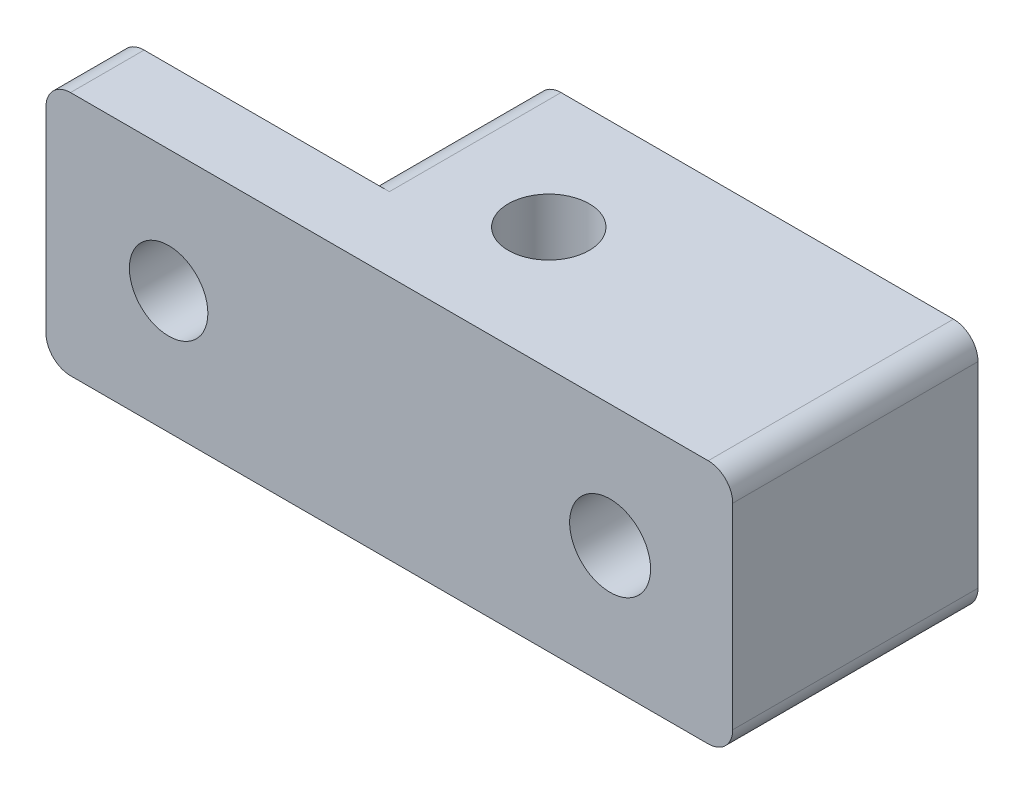
ISO-10303-21;
HEADER;
FILE_DESCRIPTION(('STEP AP214'),'2;1');
FILE_NAME('part.step','',(''),(''),'','','');
FILE_SCHEMA(('AUTOMOTIVE_DESIGN { 1 0 10303 214 1 1 1 1 }'));
ENDSEC;
DATA;
#1=APPLICATION_CONTEXT('core data for automotive mechanical design processes');
#2=APPLICATION_PROTOCOL_DEFINITION('international standard','automotive_design',2000,#1);
#3=PRODUCT_CONTEXT('',#1,'mechanical');
#4=PRODUCT('Part','Part','',(#3));
#5=PRODUCT_RELATED_PRODUCT_CATEGORY('part','',(#4));
#6=PRODUCT_DEFINITION_FORMATION('','',#4);
#7=PRODUCT_DEFINITION_CONTEXT('part definition',#1,'design');
#8=PRODUCT_DEFINITION('design','',#6,#7);
#9=PRODUCT_DEFINITION_SHAPE('','',#8);
#10=(LENGTH_UNIT() NAMED_UNIT(*) SI_UNIT(.MILLI.,.METRE.));
#11=(NAMED_UNIT(*) PLANE_ANGLE_UNIT() SI_UNIT($,.RADIAN.));
#12=(NAMED_UNIT(*) SI_UNIT($,.STERADIAN.) SOLID_ANGLE_UNIT());
#13=UNCERTAINTY_MEASURE_WITH_UNIT(LENGTH_MEASURE(1.E-05),#10,'distance_accuracy_value','');
#14=(GEOMETRIC_REPRESENTATION_CONTEXT(3) GLOBAL_UNCERTAINTY_ASSIGNED_CONTEXT((#13)) GLOBAL_UNIT_ASSIGNED_CONTEXT((#10,
#11,#12)) REPRESENTATION_CONTEXT('',''));
#15=CARTESIAN_POINT('',(0.,0.,0.));
#16=DIRECTION('',(0.,0.,1.));
#17=DIRECTION('',(1.,0.,0.));
#18=AXIS2_PLACEMENT_3D('',#15,#16,#17);
#19=CARTESIAN_POINT('',(0.,0.,0.));
#20=DIRECTION('',(0.,0.,1.));
#21=DIRECTION('',(1.,0.,0.));
#22=AXIS2_PLACEMENT_3D('',#19,#20,#21);
#23=PLANE('',#22);
#24=CARTESIAN_POINT('',(0.,0.,0.));
#25=DIRECTION('',(0.,0.,1.));
#26=DIRECTION('',(1.,0.,0.));
#27=AXIS2_PLACEMENT_3D('',#24,#25,#26);
#28=CIRCLE('',#27,1.65);
#29=CARTESIAN_POINT('',(1.65,0.,0.));
#30=VERTEX_POINT('',#29);
#31=EDGE_CURVE('E227',#30,#30,#28,.T.);
#32=ORIENTED_EDGE('',*,*,#31,.T.);
#33=EDGE_LOOP('',(#32));
#34=FACE_BOUND('',#33,.T.);
#35=DIRECTION('',(1.,0.,0.));
#36=VECTOR('',#35,1.);
#37=CARTESIAN_POINT('',(-23.,-5.,0.));
#38=LINE('',#37,#36);
#39=CARTESIAN_POINT('',(-12.,-5.,0.));
#40=VERTEX_POINT('',#39);
#41=CARTESIAN_POINT('',(3.99999999999999,-5.,0.));
#42=VERTEX_POINT('',#41);
#43=EDGE_CURVE('E141',#40,#42,#38,.T.);
#44=ORIENTED_EDGE('',*,*,#43,.F.);
#45=CARTESIAN_POINT('',(-12.,-4.,0.));
#46=DIRECTION('',(0.,0.,1.));
#47=DIRECTION('',(1.,0.,0.));
#48=AXIS2_PLACEMENT_3D('',#45,#46,#47);
#49=CIRCLE('',#48,1.);
#50=CARTESIAN_POINT('',(-13.,-4.,0.));
#51=VERTEX_POINT('',#50);
#52=EDGE_CURVE('E125',#40,#51,#49,.F.);
#53=ORIENTED_EDGE('',*,*,#52,.T.);
#54=DIRECTION('',(0.,1.,0.));
#55=VECTOR('',#54,1.);
#56=CARTESIAN_POINT('',(-13.,0.,0.));
#57=LINE('',#56,#55);
#58=CARTESIAN_POINT('',(-13.,4.,0.));
#59=VERTEX_POINT('',#58);
#60=EDGE_CURVE('E206',#51,#59,#57,.T.);
#61=ORIENTED_EDGE('',*,*,#60,.T.);
#62=CARTESIAN_POINT('',(-12.,4.,0.));
#63=DIRECTION('',(0.,0.,1.));
#64=DIRECTION('',(1.,0.,0.));
#65=AXIS2_PLACEMENT_3D('',#62,#63,#64);
#66=CIRCLE('',#65,1.);
#67=CARTESIAN_POINT('',(-12.,5.,0.));
#68=VERTEX_POINT('',#67);
#69=EDGE_CURVE('E136',#59,#68,#66,.F.);
#70=ORIENTED_EDGE('',*,*,#69,.T.);
#71=DIRECTION('',(-1.,0.,0.));
#72=VECTOR('',#71,1.);
#73=CARTESIAN_POINT('',(-23.,5.,0.));
#74=LINE('',#73,#72);
#75=CARTESIAN_POINT('',(3.99999999999999,5.,0.));
#76=VERTEX_POINT('',#75);
#77=EDGE_CURVE('E152',#76,#68,#74,.T.);
#78=ORIENTED_EDGE('',*,*,#77,.F.);
#79=CARTESIAN_POINT('',(4.,4.,0.));
#80=DIRECTION('',(0.,0.,1.));
#81=DIRECTION('',(1.,0.,0.));
#82=AXIS2_PLACEMENT_3D('',#79,#80,#81);
#83=CIRCLE('',#82,1.);
#84=CARTESIAN_POINT('',(5.,4.,0.));
#85=VERTEX_POINT('',#84);
#86=EDGE_CURVE('E146',#76,#85,#83,.F.);
#87=ORIENTED_EDGE('',*,*,#86,.T.);
#88=DIRECTION('',(0.,1.,0.));
#89=VECTOR('',#88,1.);
#90=CARTESIAN_POINT('',(5.,5.,0.));
#91=LINE('',#90,#89);
#92=CARTESIAN_POINT('',(5.,-4.,0.));
#93=VERTEX_POINT('',#92);
#94=EDGE_CURVE('E158',#93,#85,#91,.T.);
#95=ORIENTED_EDGE('',*,*,#94,.F.);
#96=CARTESIAN_POINT('',(4.,-4.,0.));
#97=DIRECTION('',(0.,0.,1.));
#98=DIRECTION('',(1.,0.,0.));
#99=AXIS2_PLACEMENT_3D('',#96,#97,#98);
#100=CIRCLE('',#99,1.);
#101=EDGE_CURVE('E150',#93,#42,#100,.F.);
#102=ORIENTED_EDGE('',*,*,#101,.T.);
#103=EDGE_LOOP('',(#44,#53,#61,#70,#78,#87,#95,#102));
#104=FACE_BOUND('',#103,.T.);
#105=ADVANCED_FACE('F35',(#34,#104),#23,.F.);
#106=CARTESIAN_POINT('',(-23.,5.,10.));
#107=DIRECTION('',(0.,-1.,0.));
#108=DIRECTION('',(0.,0.,-1.));
#109=AXIS2_PLACEMENT_3D('',#106,#107,#108);
#110=PLANE('',#109);
#111=CARTESIAN_POINT('',(-7.5,5.,5.));
#112=DIRECTION('',(0.,1.,0.));
#113=DIRECTION('',(0.,0.,1.));
#114=AXIS2_PLACEMENT_3D('',#111,#112,#113);
#115=CIRCLE('',#114,1.65);
#116=CARTESIAN_POINT('',(-7.5,5.,6.65));
#117=VERTEX_POINT('',#116);
#118=EDGE_CURVE('E217',#117,#117,#115,.T.);
#119=ORIENTED_EDGE('',*,*,#118,.F.);
#120=EDGE_LOOP('',(#119));
#121=FACE_BOUND('',#120,.T.);
#122=ORIENTED_EDGE('',*,*,#77,.T.);
#123=DIRECTION('',(0.,0.,-1.));
#124=VECTOR('',#123,1.);
#125=CARTESIAN_POINT('',(-12.,5.,7.));
#126=LINE('',#125,#124);
#127=CARTESIAN_POINT('',(-12.,5.,7.));
#128=VERTEX_POINT('',#127);
#129=EDGE_CURVE('E177',#68,#128,#126,.F.);
#130=ORIENTED_EDGE('',*,*,#129,.T.);
#131=DIRECTION('',(1.,0.,0.));
#132=VECTOR('',#131,1.);
#133=CARTESIAN_POINT('',(0.,5.,7.));
#134=LINE('',#133,#132);
#135=CARTESIAN_POINT('',(-22.,5.,7.));
#136=VERTEX_POINT('',#135);
#137=EDGE_CURVE('E213',#136,#128,#134,.T.);
#138=ORIENTED_EDGE('',*,*,#137,.F.);
#139=DIRECTION('',(0.,0.,-1.));
#140=VECTOR('',#139,1.);
#141=CARTESIAN_POINT('',(-22.,5.,10.));
#142=LINE('',#141,#140);
#143=CARTESIAN_POINT('',(-22.,5.,10.));
#144=VERTEX_POINT('',#143);
#145=EDGE_CURVE('E172',#136,#144,#142,.F.);
#146=ORIENTED_EDGE('',*,*,#145,.T.);
#147=DIRECTION('',(-1.,0.,0.));
#148=VECTOR('',#147,1.);
#149=CARTESIAN_POINT('',(-23.,5.,10.));
#150=LINE('',#149,#148);
#151=CARTESIAN_POINT('',(3.99999999999999,5.,10.));
#152=VERTEX_POINT('',#151);
#153=EDGE_CURVE('E155',#152,#144,#150,.T.);
#154=ORIENTED_EDGE('',*,*,#153,.F.);
#155=DIRECTION('',(0.,0.,-1.));
#156=VECTOR('',#155,1.);
#157=CARTESIAN_POINT('',(4.,5.,10.));
#158=LINE('',#157,#156);
#159=EDGE_CURVE('E174',#152,#76,#158,.T.);
#160=ORIENTED_EDGE('',*,*,#159,.T.);
#161=EDGE_LOOP('',(#122,#130,#138,#146,#154,#160));
#162=FACE_BOUND('',#161,.T.);
#163=ADVANCED_FACE('F255',(#121,#162),#110,.F.);
#164=CARTESIAN_POINT('',(-23.,5.,10.));
#165=DIRECTION('',(1.,0.,0.));
#166=DIRECTION('',(0.,0.,-1.));
#167=AXIS2_PLACEMENT_3D('',#164,#165,#166);
#168=PLANE('',#167);
#169=DIRECTION('',(0.,-1.,0.));
#170=VECTOR('',#169,1.);
#171=CARTESIAN_POINT('',(-23.,5.,10.));
#172=LINE('',#171,#170);
#173=CARTESIAN_POINT('',(-23.,4.,10.));
#174=VERTEX_POINT('',#173);
#175=CARTESIAN_POINT('',(-23.,-4.,10.));
#176=VERTEX_POINT('',#175);
#177=EDGE_CURVE('E235',#174,#176,#172,.T.);
#178=ORIENTED_EDGE('',*,*,#177,.F.);
#179=DIRECTION('',(0.,0.,-1.));
#180=VECTOR('',#179,1.);
#181=CARTESIAN_POINT('',(-23.,4.,10.));
#182=LINE('',#181,#180);
#183=CARTESIAN_POINT('',(-23.,4.,7.));
#184=VERTEX_POINT('',#183);
#185=EDGE_CURVE('E195',#174,#184,#182,.T.);
#186=ORIENTED_EDGE('',*,*,#185,.T.);
#187=DIRECTION('',(0.,1.,0.));
#188=VECTOR('',#187,1.);
#189=CARTESIAN_POINT('',(-23.,0.,7.));
#190=LINE('',#189,#188);
#191=CARTESIAN_POINT('',(-23.,-4.,7.));
#192=VERTEX_POINT('',#191);
#193=EDGE_CURVE('E208',#192,#184,#190,.T.);
#194=ORIENTED_EDGE('',*,*,#193,.F.);
#195=DIRECTION('',(0.,0.,-1.));
#196=VECTOR('',#195,1.);
#197=CARTESIAN_POINT('',(-23.,-4.,10.));
#198=LINE('',#197,#196);
#199=EDGE_CURVE('E193',#192,#176,#198,.F.);
#200=ORIENTED_EDGE('',*,*,#199,.T.);
#201=EDGE_LOOP('',(#178,#186,#194,#200));
#202=FACE_BOUND('',#201,.T.);
#203=ADVANCED_FACE('F262',(#202),#168,.F.);
#204=CARTESIAN_POINT('',(-23.,-5.,10.));
#205=DIRECTION('',(0.,1.,0.));
#206=DIRECTION('',(0.,0.,1.));
#207=AXIS2_PLACEMENT_3D('',#204,#205,#206);
#208=PLANE('',#207);
#209=CARTESIAN_POINT('',(-7.5,-5.,5.));
#210=DIRECTION('',(0.,1.,0.));
#211=DIRECTION('',(0.,0.,1.));
#212=AXIS2_PLACEMENT_3D('',#209,#210,#211);
#213=CIRCLE('',#212,1.65);
#214=CARTESIAN_POINT('',(-7.5,-5.,6.65));
#215=VERTEX_POINT('',#214);
#216=EDGE_CURVE('E219',#215,#215,#213,.T.);
#217=ORIENTED_EDGE('',*,*,#216,.T.);
#218=EDGE_LOOP('',(#217));
#219=FACE_BOUND('',#218,.T.);
#220=DIRECTION('',(-1.,0.,0.));
#221=VECTOR('',#220,1.);
#222=CARTESIAN_POINT('',(0.,-5.,7.));
#223=LINE('',#222,#221);
#224=CARTESIAN_POINT('',(-12.,-5.,7.));
#225=VERTEX_POINT('',#224);
#226=CARTESIAN_POINT('',(-22.,-5.,7.));
#227=VERTEX_POINT('',#226);
#228=EDGE_CURVE('E144',#225,#227,#223,.T.);
#229=ORIENTED_EDGE('',*,*,#228,.F.);
#230=DIRECTION('',(0.,0.,-1.));
#231=VECTOR('',#230,1.);
#232=CARTESIAN_POINT('',(-12.,-5.,0.));
#233=LINE('',#232,#231);
#234=EDGE_CURVE('E129',#225,#40,#233,.T.);
#235=ORIENTED_EDGE('',*,*,#234,.T.);
#236=ORIENTED_EDGE('',*,*,#43,.T.);
#237=DIRECTION('',(0.,0.,-1.));
#238=VECTOR('',#237,1.);
#239=CARTESIAN_POINT('',(4.,-5.,10.));
#240=LINE('',#239,#238);
#241=CARTESIAN_POINT('',(3.99999999999999,-5.,10.));
#242=VERTEX_POINT('',#241);
#243=EDGE_CURVE('E147',#42,#242,#240,.F.);
#244=ORIENTED_EDGE('',*,*,#243,.T.);
#245=DIRECTION('',(1.,0.,0.));
#246=VECTOR('',#245,1.);
#247=CARTESIAN_POINT('',(-23.,-5.,10.));
#248=LINE('',#247,#246);
#249=CARTESIAN_POINT('',(-22.,-5.,10.));
#250=VERTEX_POINT('',#249);
#251=EDGE_CURVE('E164',#250,#242,#248,.T.);
#252=ORIENTED_EDGE('',*,*,#251,.F.);
#253=DIRECTION('',(0.,0.,-1.));
#254=VECTOR('',#253,1.);
#255=CARTESIAN_POINT('',(-22.,-5.,10.));
#256=LINE('',#255,#254);
#257=EDGE_CURVE('E162',#250,#227,#256,.T.);
#258=ORIENTED_EDGE('',*,*,#257,.T.);
#259=EDGE_LOOP('',(#229,#235,#236,#244,#252,#258));
#260=FACE_BOUND('',#259,.T.);
#261=ADVANCED_FACE('F140',(#219,#260),#208,.F.);
#262=CARTESIAN_POINT('',(-18.,0.,10.));
#263=DIRECTION('',(0.,0.,-1.));
#264=DIRECTION('',(-1.,0.,0.));
#265=AXIS2_PLACEMENT_3D('',#262,#263,#264);
#266=CYLINDRICAL_SURFACE('',#265,1.6);
#267=CARTESIAN_POINT('',(-18.,0.,10.));
#268=DIRECTION('',(0.,0.,1.));
#269=DIRECTION('',(1.,0.,0.));
#270=AXIS2_PLACEMENT_3D('',#267,#268,#269);
#271=CIRCLE('',#270,1.6);
#272=CARTESIAN_POINT('',(-16.4,0.,10.));
#273=VERTEX_POINT('',#272);
#274=EDGE_CURVE('E222',#273,#273,#271,.T.);
#275=ORIENTED_EDGE('',*,*,#274,.T.);
#276=EDGE_LOOP('',(#275));
#277=FACE_BOUND('',#276,.T.);
#278=CARTESIAN_POINT('',(-18.,0.,7.));
#279=DIRECTION('',(0.,0.,-1.));
#280=DIRECTION('',(-1.,0.,0.));
#281=AXIS2_PLACEMENT_3D('',#278,#279,#280);
#282=CIRCLE('',#281,1.6);
#283=CARTESIAN_POINT('',(-19.6,0.,7.));
#284=VERTEX_POINT('',#283);
#285=EDGE_CURVE('E215',#284,#284,#282,.F.);
#286=ORIENTED_EDGE('',*,*,#285,.F.);
#287=EDGE_LOOP('',(#286));
#288=FACE_BOUND('',#287,.T.);
#289=ADVANCED_FACE('F293',(#277,#288),#266,.F.);
#290=CARTESIAN_POINT('',(0.,0.,10.));
#291=DIRECTION('',(0.,0.,1.));
#292=DIRECTION('',(1.,0.,0.));
#293=AXIS2_PLACEMENT_3D('',#290,#291,#292);
#294=PLANE('',#293);
#295=CARTESIAN_POINT('',(0.,0.,10.));
#296=DIRECTION('',(0.,0.,1.));
#297=DIRECTION('',(1.,0.,0.));
#298=AXIS2_PLACEMENT_3D('',#295,#296,#297);
#299=CIRCLE('',#298,1.65);
#300=CARTESIAN_POINT('',(1.65,0.,10.));
#301=VERTEX_POINT('',#300);
#302=EDGE_CURVE('E228',#301,#301,#299,.T.);
#303=ORIENTED_EDGE('',*,*,#302,.F.);
#304=EDGE_LOOP('',(#303));
#305=FACE_BOUND('',#304,.T.);
#306=ORIENTED_EDGE('',*,*,#251,.T.);
#307=CARTESIAN_POINT('',(4.,-4.,10.));
#308=DIRECTION('',(0.,0.,1.));
#309=DIRECTION('',(1.,0.,0.));
#310=AXIS2_PLACEMENT_3D('',#307,#308,#309);
#311=CIRCLE('',#310,1.);
#312=CARTESIAN_POINT('',(5.,-4.,10.));
#313=VERTEX_POINT('',#312);
#314=EDGE_CURVE('E191',#242,#313,#311,.T.);
#315=ORIENTED_EDGE('',*,*,#314,.T.);
#316=DIRECTION('',(0.,1.,0.));
#317=VECTOR('',#316,1.);
#318=CARTESIAN_POINT('',(5.,5.,10.));
#319=LINE('',#318,#317);
#320=CARTESIAN_POINT('',(5.,4.,10.));
#321=VERTEX_POINT('',#320);
#322=EDGE_CURVE('E151',#313,#321,#319,.T.);
#323=ORIENTED_EDGE('',*,*,#322,.T.);
#324=CARTESIAN_POINT('',(4.,4.,10.));
#325=DIRECTION('',(0.,0.,1.));
#326=DIRECTION('',(1.,0.,0.));
#327=AXIS2_PLACEMENT_3D('',#324,#325,#326);
#328=CIRCLE('',#327,1.);
#329=EDGE_CURVE('E189',#321,#152,#328,.T.);
#330=ORIENTED_EDGE('',*,*,#329,.T.);
#331=ORIENTED_EDGE('',*,*,#153,.T.);
#332=CARTESIAN_POINT('',(-22.,4.,10.));
#333=DIRECTION('',(0.,0.,1.));
#334=DIRECTION('',(1.,0.,0.));
#335=AXIS2_PLACEMENT_3D('',#332,#333,#334);
#336=CIRCLE('',#335,1.);
#337=EDGE_CURVE('E187',#144,#174,#336,.T.);
#338=ORIENTED_EDGE('',*,*,#337,.T.);
#339=ORIENTED_EDGE('',*,*,#177,.T.);
#340=CARTESIAN_POINT('',(-22.,-4.,10.));
#341=DIRECTION('',(0.,0.,1.));
#342=DIRECTION('',(1.,0.,0.));
#343=AXIS2_PLACEMENT_3D('',#340,#341,#342);
#344=CIRCLE('',#343,1.);
#345=EDGE_CURVE('E185',#176,#250,#344,.T.);
#346=ORIENTED_EDGE('',*,*,#345,.T.);
#347=EDGE_LOOP('',(#306,#315,#323,#330,#331,#338,#339,#346));
#348=FACE_BOUND('',#347,.T.);
#349=ORIENTED_EDGE('',*,*,#274,.F.);
#350=EDGE_LOOP('',(#349));
#351=FACE_BOUND('',#350,.T.);
#352=ADVANCED_FACE('F251',(#305,#348,#351),#294,.T.);
#353=CARTESIAN_POINT('',(5.,5.,10.));
#354=DIRECTION('',(-1.,0.,0.));
#355=DIRECTION('',(0.,-1.,0.));
#356=AXIS2_PLACEMENT_3D('',#353,#354,#355);
#357=PLANE('',#356);
#358=ORIENTED_EDGE('',*,*,#322,.F.);
#359=DIRECTION('',(0.,0.,-1.));
#360=VECTOR('',#359,1.);
#361=CARTESIAN_POINT('',(5.,-4.,10.));
#362=LINE('',#361,#360);
#363=EDGE_CURVE('E182',#313,#93,#362,.T.);
#364=ORIENTED_EDGE('',*,*,#363,.T.);
#365=ORIENTED_EDGE('',*,*,#94,.T.);
#366=DIRECTION('',(0.,0.,-1.));
#367=VECTOR('',#366,1.);
#368=CARTESIAN_POINT('',(5.,4.,10.));
#369=LINE('',#368,#367);
#370=EDGE_CURVE('E180',#85,#321,#369,.F.);
#371=ORIENTED_EDGE('',*,*,#370,.T.);
#372=EDGE_LOOP('',(#358,#364,#365,#371));
#373=FACE_BOUND('',#372,.T.);
#374=ADVANCED_FACE('F243',(#373),#357,.F.);
#375=CARTESIAN_POINT('',(0.,0.,10.));
#376=DIRECTION('',(0.,0.,-1.));
#377=DIRECTION('',(-1.,0.,0.));
#378=AXIS2_PLACEMENT_3D('',#375,#376,#377);
#379=CYLINDRICAL_SURFACE('',#378,1.65);
#380=ORIENTED_EDGE('',*,*,#302,.T.);
#381=EDGE_LOOP('',(#380));
#382=FACE_BOUND('',#381,.T.);
#383=ORIENTED_EDGE('',*,*,#31,.F.);
#384=EDGE_LOOP('',(#383));
#385=FACE_BOUND('',#384,.T.);
#386=ADVANCED_FACE('F299',(#382,#385),#379,.F.);
#387=CARTESIAN_POINT('',(-7.5,-5.,5.));
#388=DIRECTION('',(0.,1.,0.));
#389=DIRECTION('',(0.,0.,1.));
#390=AXIS2_PLACEMENT_3D('',#387,#388,#389);
#391=CYLINDRICAL_SURFACE('',#390,1.65);
#392=ORIENTED_EDGE('',*,*,#216,.F.);
#393=EDGE_LOOP('',(#392));
#394=FACE_BOUND('',#393,.T.);
#395=ORIENTED_EDGE('',*,*,#118,.T.);
#396=EDGE_LOOP('',(#395));
#397=FACE_BOUND('',#396,.T.);
#398=ADVANCED_FACE('F309',(#394,#397),#391,.F.);
#399=CARTESIAN_POINT('',(-13.,0.,7.));
#400=DIRECTION('',(-1.,0.,0.));
#401=DIRECTION('',(0.,0.,1.));
#402=AXIS2_PLACEMENT_3D('',#399,#400,#401);
#403=PLANE('',#402);
#404=ORIENTED_EDGE('',*,*,#60,.F.);
#405=DIRECTION('',(0.,0.,-1.));
#406=VECTOR('',#405,1.);
#407=CARTESIAN_POINT('',(-13.,-4.,7.));
#408=LINE('',#407,#406);
#409=CARTESIAN_POINT('',(-13.,-4.,7.));
#410=VERTEX_POINT('',#409);
#411=EDGE_CURVE('E130',#51,#410,#408,.F.);
#412=ORIENTED_EDGE('',*,*,#411,.T.);
#413=DIRECTION('',(0.,1.,0.));
#414=VECTOR('',#413,1.);
#415=CARTESIAN_POINT('',(-13.,0.,7.));
#416=LINE('',#415,#414);
#417=CARTESIAN_POINT('',(-13.,4.,7.));
#418=VERTEX_POINT('',#417);
#419=EDGE_CURVE('E202',#410,#418,#416,.T.);
#420=ORIENTED_EDGE('',*,*,#419,.T.);
#421=DIRECTION('',(0.,0.,-1.));
#422=VECTOR('',#421,1.);
#423=CARTESIAN_POINT('',(-13.,4.,0.));
#424=LINE('',#423,#422);
#425=EDGE_CURVE('E135',#418,#59,#424,.T.);
#426=ORIENTED_EDGE('',*,*,#425,.T.);
#427=EDGE_LOOP('',(#404,#412,#420,#426));
#428=FACE_BOUND('',#427,.T.);
#429=ADVANCED_FACE('F304',(#428),#403,.T.);
#430=CARTESIAN_POINT('',(0.,0.,7.));
#431=DIRECTION('',(0.,0.,-1.));
#432=DIRECTION('',(-1.,0.,0.));
#433=AXIS2_PLACEMENT_3D('',#430,#431,#432);
#434=PLANE('',#433);
#435=ORIENTED_EDGE('',*,*,#193,.T.);
#436=CARTESIAN_POINT('',(-22.,4.,7.));
#437=DIRECTION('',(0.,0.,-1.));
#438=DIRECTION('',(-1.,0.,0.));
#439=AXIS2_PLACEMENT_3D('',#436,#437,#438);
#440=CIRCLE('',#439,1.);
#441=EDGE_CURVE('E50',#184,#136,#440,.T.);
#442=ORIENTED_EDGE('',*,*,#441,.T.);
#443=ORIENTED_EDGE('',*,*,#137,.T.);
#444=CARTESIAN_POINT('',(-12.,4.,7.));
#445=DIRECTION('',(0.,0.,-1.));
#446=DIRECTION('',(-1.,0.,0.));
#447=AXIS2_PLACEMENT_3D('',#444,#445,#446);
#448=CIRCLE('',#447,1.);
#449=EDGE_CURVE('E11',#128,#418,#448,.F.);
#450=ORIENTED_EDGE('',*,*,#449,.T.);
#451=ORIENTED_EDGE('',*,*,#419,.F.);
#452=CARTESIAN_POINT('',(-12.,-4.,7.));
#453=DIRECTION('',(0.,0.,-1.));
#454=DIRECTION('',(-1.,0.,0.));
#455=AXIS2_PLACEMENT_3D('',#452,#453,#454);
#456=CIRCLE('',#455,1.);
#457=EDGE_CURVE('E43',#410,#225,#456,.F.);
#458=ORIENTED_EDGE('',*,*,#457,.T.);
#459=ORIENTED_EDGE('',*,*,#228,.T.);
#460=CARTESIAN_POINT('',(-22.,-4.,7.));
#461=DIRECTION('',(0.,0.,-1.));
#462=DIRECTION('',(-1.,0.,0.));
#463=AXIS2_PLACEMENT_3D('',#460,#461,#462);
#464=CIRCLE('',#463,1.);
#465=EDGE_CURVE('E58',#227,#192,#464,.T.);
#466=ORIENTED_EDGE('',*,*,#465,.T.);
#467=EDGE_LOOP('',(#435,#442,#443,#450,#451,#458,#459,#466));
#468=FACE_BOUND('',#467,.T.);
#469=ORIENTED_EDGE('',*,*,#285,.T.);
#470=EDGE_LOOP('',(#469));
#471=FACE_BOUND('',#470,.T.);
#472=ADVANCED_FACE('F199',(#468,#471),#434,.T.);
#473=CARTESIAN_POINT('',(-12.,-4.,10.));
#474=DIRECTION('',(0.,0.,1.));
#475=DIRECTION('',(1.,0.,0.));
#476=AXIS2_PLACEMENT_3D('',#473,#474,#475);
#477=CYLINDRICAL_SURFACE('',#476,1.);
#478=ORIENTED_EDGE('',*,*,#457,.F.);
#479=ORIENTED_EDGE('',*,*,#411,.F.);
#480=ORIENTED_EDGE('',*,*,#52,.F.);
#481=ORIENTED_EDGE('',*,*,#234,.F.);
#482=EDGE_LOOP('',(#478,#479,#480,#481));
#483=FACE_BOUND('',#482,.T.);
#484=ADVANCED_FACE('F128',(#483),#477,.T.);
#485=CARTESIAN_POINT('',(-12.,4.,7.));
#486=DIRECTION('',(0.,0.,1.));
#487=DIRECTION('',(1.,0.,0.));
#488=AXIS2_PLACEMENT_3D('',#485,#486,#487);
#489=CYLINDRICAL_SURFACE('',#488,1.);
#490=ORIENTED_EDGE('',*,*,#449,.F.);
#491=ORIENTED_EDGE('',*,*,#129,.F.);
#492=ORIENTED_EDGE('',*,*,#69,.F.);
#493=ORIENTED_EDGE('',*,*,#425,.F.);
#494=EDGE_LOOP('',(#490,#491,#492,#493));
#495=FACE_BOUND('',#494,.T.);
#496=ADVANCED_FACE('F271',(#495),#489,.T.);
#497=CARTESIAN_POINT('',(4.,-4.,10.));
#498=DIRECTION('',(0.,0.,-1.));
#499=DIRECTION('',(-1.,0.,0.));
#500=AXIS2_PLACEMENT_3D('',#497,#498,#499);
#501=CYLINDRICAL_SURFACE('',#500,1.);
#502=ORIENTED_EDGE('',*,*,#314,.F.);
#503=ORIENTED_EDGE('',*,*,#243,.F.);
#504=ORIENTED_EDGE('',*,*,#101,.F.);
#505=ORIENTED_EDGE('',*,*,#363,.F.);
#506=EDGE_LOOP('',(#502,#503,#504,#505));
#507=FACE_BOUND('',#506,.T.);
#508=ADVANCED_FACE('F269',(#507),#501,.T.);
#509=CARTESIAN_POINT('',(4.,4.,10.));
#510=DIRECTION('',(0.,0.,-1.));
#511=DIRECTION('',(-1.,0.,0.));
#512=AXIS2_PLACEMENT_3D('',#509,#510,#511);
#513=CYLINDRICAL_SURFACE('',#512,1.);
#514=ORIENTED_EDGE('',*,*,#329,.F.);
#515=ORIENTED_EDGE('',*,*,#370,.F.);
#516=ORIENTED_EDGE('',*,*,#86,.F.);
#517=ORIENTED_EDGE('',*,*,#159,.F.);
#518=EDGE_LOOP('',(#514,#515,#516,#517));
#519=FACE_BOUND('',#518,.T.);
#520=ADVANCED_FACE('F247',(#519),#513,.T.);
#521=CARTESIAN_POINT('',(-22.,4.,10.));
#522=DIRECTION('',(0.,0.,-1.));
#523=DIRECTION('',(-1.,0.,0.));
#524=AXIS2_PLACEMENT_3D('',#521,#522,#523);
#525=CYLINDRICAL_SURFACE('',#524,1.);
#526=ORIENTED_EDGE('',*,*,#337,.F.);
#527=ORIENTED_EDGE('',*,*,#145,.F.);
#528=ORIENTED_EDGE('',*,*,#441,.F.);
#529=ORIENTED_EDGE('',*,*,#185,.F.);
#530=EDGE_LOOP('',(#526,#527,#528,#529));
#531=FACE_BOUND('',#530,.T.);
#532=ADVANCED_FACE('F258',(#531),#525,.T.);
#533=CARTESIAN_POINT('',(-22.,-4.,10.));
#534=DIRECTION('',(0.,0.,-1.));
#535=DIRECTION('',(-1.,0.,0.));
#536=AXIS2_PLACEMENT_3D('',#533,#534,#535);
#537=CYLINDRICAL_SURFACE('',#536,1.);
#538=ORIENTED_EDGE('',*,*,#345,.F.);
#539=ORIENTED_EDGE('',*,*,#199,.F.);
#540=ORIENTED_EDGE('',*,*,#465,.F.);
#541=ORIENTED_EDGE('',*,*,#257,.F.);
#542=EDGE_LOOP('',(#538,#539,#540,#541));
#543=FACE_BOUND('',#542,.T.);
#544=ADVANCED_FACE('F37',(#543),#537,.T.);
#545=CLOSED_SHELL('',(#105,#163,#203,#261,#289,#352,#374,#386,#398,#429,#472,#484,#496,#508,
#520,#532,#544));
#546=MANIFOLD_SOLID_BREP('B2',#545);
#547=ADVANCED_BREP_SHAPE_REPRESENTATION('',(#18,#546),#14);
#548=SHAPE_DEFINITION_REPRESENTATION(#9,#547);
ENDSEC;
END-ISO-10303-21;
